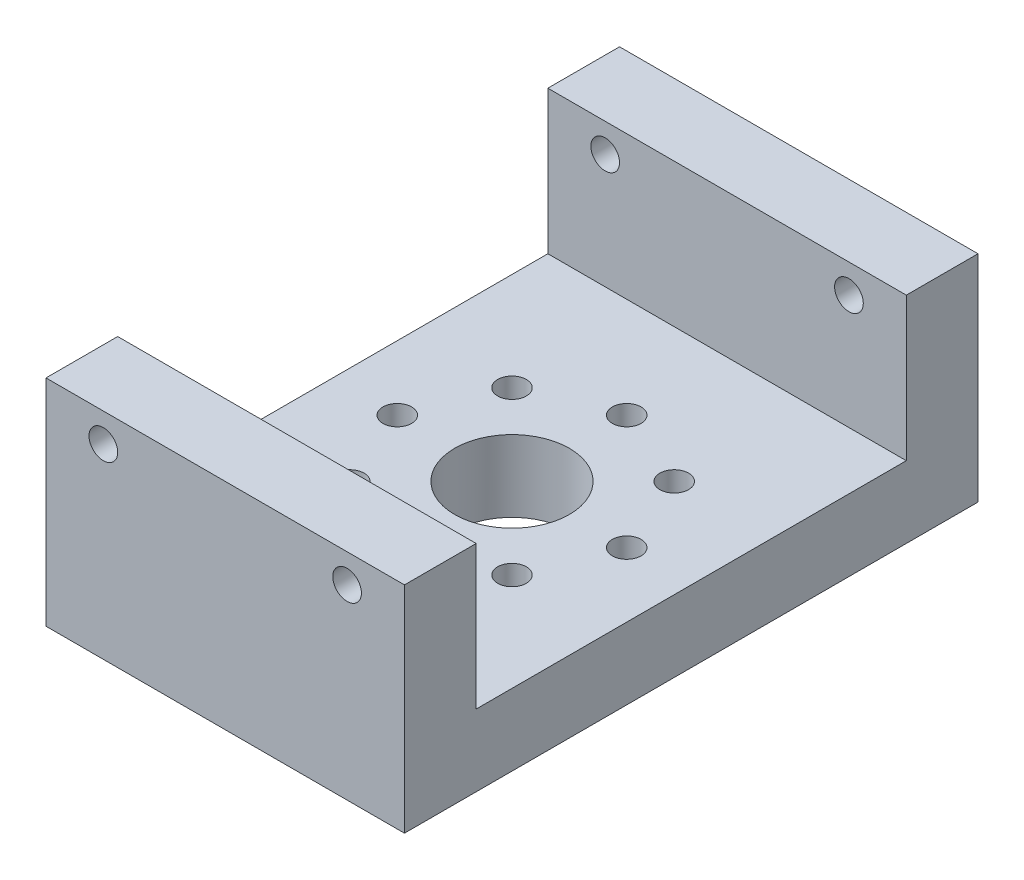
ISO-10303-21;
HEADER;
FILE_DESCRIPTION(('STEP AP214'),'2;1');
FILE_NAME('part.step','',(''),(''),'','','');
FILE_SCHEMA(('AUTOMOTIVE_DESIGN { 1 0 10303 214 1 1 1 1 }'));
ENDSEC;
DATA;
#1=APPLICATION_CONTEXT('core data for automotive mechanical design processes');
#2=APPLICATION_PROTOCOL_DEFINITION('international standard','automotive_design',2000,#1);
#3=PRODUCT_CONTEXT('',#1,'mechanical');
#4=PRODUCT('Part','Part','',(#3));
#5=PRODUCT_RELATED_PRODUCT_CATEGORY('part','',(#4));
#6=PRODUCT_DEFINITION_FORMATION('','',#4);
#7=PRODUCT_DEFINITION_CONTEXT('part definition',#1,'design');
#8=PRODUCT_DEFINITION('design','',#6,#7);
#9=PRODUCT_DEFINITION_SHAPE('','',#8);
#10=(LENGTH_UNIT() NAMED_UNIT(*) SI_UNIT(.MILLI.,.METRE.));
#11=(NAMED_UNIT(*) PLANE_ANGLE_UNIT() SI_UNIT($,.RADIAN.));
#12=(NAMED_UNIT(*) SI_UNIT($,.STERADIAN.) SOLID_ANGLE_UNIT());
#13=UNCERTAINTY_MEASURE_WITH_UNIT(LENGTH_MEASURE(1.E-05),#10,'distance_accuracy_value','');
#14=(GEOMETRIC_REPRESENTATION_CONTEXT(3) GLOBAL_UNCERTAINTY_ASSIGNED_CONTEXT((#13)) GLOBAL_UNIT_ASSIGNED_CONTEXT((#10,
#11,#12)) REPRESENTATION_CONTEXT('',''));
#15=CARTESIAN_POINT('',(0.,0.,0.));
#16=DIRECTION('',(0.,0.,1.));
#17=DIRECTION('',(1.,0.,0.));
#18=AXIS2_PLACEMENT_3D('',#15,#16,#17);
#19=CARTESIAN_POINT('',(0.,5.,0.));
#20=DIRECTION('',(0.,1.,0.));
#21=DIRECTION('',(0.,0.,1.));
#22=AXIS2_PLACEMENT_3D('',#19,#20,#21);
#23=PLANE('',#22);
#24=CARTESIAN_POINT('',(0.,5.,8.));
#25=DIRECTION('',(0.,1.,0.));
#26=DIRECTION('',(0.,0.,1.));
#27=AXIS2_PLACEMENT_3D('',#24,#25,#26);
#28=CIRCLE('',#27,1.);
#29=CARTESIAN_POINT('',(0.,5.,9.));
#30=VERTEX_POINT('',#29);
#31=EDGE_CURVE('E173',#30,#30,#28,.T.);
#32=ORIENTED_EDGE('',*,*,#31,.F.);
#33=EDGE_LOOP('',(#32));
#34=FACE_BOUND('',#33,.T.);
#35=CARTESIAN_POINT('',(-5.65685424949238,5.,-5.65685424949238));
#36=DIRECTION('',(0.,1.,0.));
#37=DIRECTION('',(0.,0.,1.));
#38=AXIS2_PLACEMENT_3D('',#35,#36,#37);
#39=CIRCLE('',#38,1.);
#40=CARTESIAN_POINT('',(-5.65685424949238,5.,-4.65685424949238));
#41=VERTEX_POINT('',#40);
#42=EDGE_CURVE('E556',#41,#41,#39,.T.);
#43=ORIENTED_EDGE('',*,*,#42,.F.);
#44=EDGE_LOOP('',(#43));
#45=FACE_BOUND('',#44,.T.);
#46=CARTESIAN_POINT('',(-8.,5.,0.));
#47=DIRECTION('',(0.,1.,0.));
#48=DIRECTION('',(0.,0.,1.));
#49=AXIS2_PLACEMENT_3D('',#46,#47,#48);
#50=CIRCLE('',#49,1.);
#51=CARTESIAN_POINT('',(-8.,5.,0.999999999999998));
#52=VERTEX_POINT('',#51);
#53=EDGE_CURVE('E554',#52,#52,#50,.T.);
#54=ORIENTED_EDGE('',*,*,#53,.F.);
#55=EDGE_LOOP('',(#54));
#56=FACE_BOUND('',#55,.T.);
#57=CARTESIAN_POINT('',(-5.65685424949238,5.,5.65685424949238));
#58=DIRECTION('',(0.,1.,0.));
#59=DIRECTION('',(0.,0.,1.));
#60=AXIS2_PLACEMENT_3D('',#57,#58,#59);
#61=CIRCLE('',#60,1.);
#62=CARTESIAN_POINT('',(-5.65685424949238,5.,6.65685424949238));
#63=VERTEX_POINT('',#62);
#64=EDGE_CURVE('E551',#63,#63,#61,.T.);
#65=ORIENTED_EDGE('',*,*,#64,.F.);
#66=EDGE_LOOP('',(#65));
#67=FACE_BOUND('',#66,.T.);
#68=CARTESIAN_POINT('',(0.,5.,0.));
#69=DIRECTION('',(0.,1.,0.));
#70=DIRECTION('',(0.,0.,1.));
#71=AXIS2_PLACEMENT_3D('',#68,#69,#70);
#72=CIRCLE('',#71,4.);
#73=CARTESIAN_POINT('',(0.,5.,4.));
#74=VERTEX_POINT('',#73);
#75=EDGE_CURVE('E548',#74,#74,#72,.T.);
#76=ORIENTED_EDGE('',*,*,#75,.F.);
#77=EDGE_LOOP('',(#76));
#78=FACE_BOUND('',#77,.T.);
#79=CARTESIAN_POINT('',(0.,5.,-8.));
#80=DIRECTION('',(0.,1.,0.));
#81=DIRECTION('',(0.,0.,1.));
#82=AXIS2_PLACEMENT_3D('',#79,#80,#81);
#83=CIRCLE('',#82,1.);
#84=CARTESIAN_POINT('',(0.,5.,-7.));
#85=VERTEX_POINT('',#84);
#86=EDGE_CURVE('E545',#85,#85,#83,.T.);
#87=ORIENTED_EDGE('',*,*,#86,.F.);
#88=EDGE_LOOP('',(#87));
#89=FACE_BOUND('',#88,.T.);
#90=CARTESIAN_POINT('',(5.65685424949238,5.,-5.65685424949238));
#91=DIRECTION('',(0.,1.,0.));
#92=DIRECTION('',(0.,0.,1.));
#93=AXIS2_PLACEMENT_3D('',#90,#91,#92);
#94=CIRCLE('',#93,1.);
#95=CARTESIAN_POINT('',(5.65685424949238,5.,-4.65685424949238));
#96=VERTEX_POINT('',#95);
#97=EDGE_CURVE('E542',#96,#96,#94,.T.);
#98=ORIENTED_EDGE('',*,*,#97,.F.);
#99=EDGE_LOOP('',(#98));
#100=FACE_BOUND('',#99,.T.);
#101=CARTESIAN_POINT('',(8.,5.,0.));
#102=DIRECTION('',(0.,1.,0.));
#103=DIRECTION('',(0.,0.,1.));
#104=AXIS2_PLACEMENT_3D('',#101,#102,#103);
#105=CIRCLE('',#104,1.);
#106=CARTESIAN_POINT('',(8.,5.,1.));
#107=VERTEX_POINT('',#106);
#108=EDGE_CURVE('E514',#107,#107,#105,.T.);
#109=ORIENTED_EDGE('',*,*,#108,.F.);
#110=EDGE_LOOP('',(#109));
#111=FACE_BOUND('',#110,.T.);
#112=CARTESIAN_POINT('',(5.65685424949238,5.,5.65685424949238));
#113=DIRECTION('',(0.,1.,0.));
#114=DIRECTION('',(0.,0.,1.));
#115=AXIS2_PLACEMENT_3D('',#112,#113,#114);
#116=CIRCLE('',#115,1.);
#117=CARTESIAN_POINT('',(5.65685424949238,5.,6.65685424949238));
#118=VERTEX_POINT('',#117);
#119=EDGE_CURVE('E510',#118,#118,#116,.T.);
#120=ORIENTED_EDGE('',*,*,#119,.F.);
#121=EDGE_LOOP('',(#120));
#122=FACE_BOUND('',#121,.T.);
#123=DIRECTION('',(0.,0.,1.));
#124=VECTOR('',#123,1.);
#125=CARTESIAN_POINT('',(-12.5,5.,-20.));
#126=LINE('',#125,#124);
#127=CARTESIAN_POINT('',(-12.5,5.,-15.));
#128=VERTEX_POINT('',#127);
#129=CARTESIAN_POINT('',(-12.5,5.,15.));
#130=VERTEX_POINT('',#129);
#131=EDGE_CURVE('E129',#128,#130,#126,.T.);
#132=ORIENTED_EDGE('',*,*,#131,.T.);
#133=DIRECTION('',(-1.,0.,0.));
#134=VECTOR('',#133,1.);
#135=CARTESIAN_POINT('',(-12.5,5.,15.));
#136=LINE('',#135,#134);
#137=CARTESIAN_POINT('',(12.5,5.,15.));
#138=VERTEX_POINT('',#137);
#139=EDGE_CURVE('E118',#138,#130,#136,.T.);
#140=ORIENTED_EDGE('',*,*,#139,.F.);
#141=DIRECTION('',(0.,0.,-1.));
#142=VECTOR('',#141,1.);
#143=CARTESIAN_POINT('',(12.5,5.,-20.));
#144=LINE('',#143,#142);
#145=CARTESIAN_POINT('',(12.5,5.,-15.));
#146=VERTEX_POINT('',#145);
#147=EDGE_CURVE('E135',#138,#146,#144,.T.);
#148=ORIENTED_EDGE('',*,*,#147,.T.);
#149=DIRECTION('',(1.,0.,0.));
#150=VECTOR('',#149,1.);
#151=CARTESIAN_POINT('',(-12.5,5.,-15.));
#152=LINE('',#151,#150);
#153=EDGE_CURVE('E76',#128,#146,#152,.T.);
#154=ORIENTED_EDGE('',*,*,#153,.F.);
#155=EDGE_LOOP('',(#132,#140,#148,#154));
#156=FACE_BOUND('',#155,.T.);
#157=ADVANCED_FACE('F51',(#34,#45,#56,#67,#78,#89,#100,#111,#122,#156),#23,.T.);
#158=CARTESIAN_POINT('',(12.5,5.,-20.));
#159=DIRECTION('',(-1.,0.,0.));
#160=DIRECTION('',(0.,0.,1.));
#161=AXIS2_PLACEMENT_3D('',#158,#159,#160);
#162=PLANE('',#161);
#163=DIRECTION('',(0.,0.,-1.));
#164=VECTOR('',#163,1.);
#165=CARTESIAN_POINT('',(12.5,0.,-20.));
#166=LINE('',#165,#164);
#167=CARTESIAN_POINT('',(12.5,0.,20.));
#168=VERTEX_POINT('',#167);
#169=CARTESIAN_POINT('',(12.5,0.,-20.));
#170=VERTEX_POINT('',#169);
#171=EDGE_CURVE('E144',#168,#170,#166,.T.);
#172=ORIENTED_EDGE('',*,*,#171,.T.);
#173=DIRECTION('',(0.,-1.,0.));
#174=VECTOR('',#173,1.);
#175=CARTESIAN_POINT('',(12.5,5.,-20.));
#176=LINE('',#175,#174);
#177=CARTESIAN_POINT('',(12.5,15.,-20.));
#178=VERTEX_POINT('',#177);
#179=EDGE_CURVE('E13',#178,#170,#176,.T.);
#180=ORIENTED_EDGE('',*,*,#179,.F.);
#181=DIRECTION('',(0.,0.,-1.));
#182=VECTOR('',#181,1.);
#183=CARTESIAN_POINT('',(12.5,15.,-20.));
#184=LINE('',#183,#182);
#185=CARTESIAN_POINT('',(12.5,15.,-15.));
#186=VERTEX_POINT('',#185);
#187=EDGE_CURVE('E197',#186,#178,#184,.T.);
#188=ORIENTED_EDGE('',*,*,#187,.F.);
#189=DIRECTION('',(0.,-1.,0.));
#190=VECTOR('',#189,1.);
#191=CARTESIAN_POINT('',(12.5,15.,-15.));
#192=LINE('',#191,#190);
#193=EDGE_CURVE('E203',#186,#146,#192,.T.);
#194=ORIENTED_EDGE('',*,*,#193,.T.);
#195=ORIENTED_EDGE('',*,*,#147,.F.);
#196=DIRECTION('',(0.,-1.,0.));
#197=VECTOR('',#196,1.);
#198=CARTESIAN_POINT('',(12.5,15.,15.));
#199=LINE('',#198,#197);
#200=CARTESIAN_POINT('',(12.5,15.,15.));
#201=VERTEX_POINT('',#200);
#202=EDGE_CURVE('E68',#201,#138,#199,.T.);
#203=ORIENTED_EDGE('',*,*,#202,.F.);
#204=DIRECTION('',(0.,0.,-1.));
#205=VECTOR('',#204,1.);
#206=CARTESIAN_POINT('',(12.5,15.,20.));
#207=LINE('',#206,#205);
#208=CARTESIAN_POINT('',(12.5,15.,20.));
#209=VERTEX_POINT('',#208);
#210=EDGE_CURVE('E186',#209,#201,#207,.T.);
#211=ORIENTED_EDGE('',*,*,#210,.F.);
#212=DIRECTION('',(0.,-1.,0.));
#213=VECTOR('',#212,1.);
#214=CARTESIAN_POINT('',(12.5,5.,20.));
#215=LINE('',#214,#213);
#216=EDGE_CURVE('E134',#209,#168,#215,.T.);
#217=ORIENTED_EDGE('',*,*,#216,.T.);
#218=EDGE_LOOP('',(#172,#180,#188,#194,#195,#203,#211,#217));
#219=FACE_BOUND('',#218,.T.);
#220=ADVANCED_FACE('F53',(#219),#162,.F.);
#221=CARTESIAN_POINT('',(-12.5,5.,-20.));
#222=DIRECTION('',(0.,0.,1.));
#223=DIRECTION('',(1.,0.,0.));
#224=AXIS2_PLACEMENT_3D('',#221,#222,#223);
#225=PLANE('',#224);
#226=CARTESIAN_POINT('',(-8.5,13.,-20.));
#227=DIRECTION('',(0.,0.,1.));
#228=DIRECTION('',(1.,0.,0.));
#229=AXIS2_PLACEMENT_3D('',#226,#227,#228);
#230=CIRCLE('',#229,0.999999999999998);
#231=CARTESIAN_POINT('',(-7.5,13.,-20.));
#232=VERTEX_POINT('',#231);
#233=EDGE_CURVE('E159',#232,#232,#230,.T.);
#234=ORIENTED_EDGE('',*,*,#233,.T.);
#235=EDGE_LOOP('',(#234));
#236=FACE_BOUND('',#235,.T.);
#237=CARTESIAN_POINT('',(8.5,13.,-20.));
#238=DIRECTION('',(0.,0.,1.));
#239=DIRECTION('',(1.,0.,0.));
#240=AXIS2_PLACEMENT_3D('',#237,#238,#239);
#241=CIRCLE('',#240,1.);
#242=CARTESIAN_POINT('',(9.5,13.,-20.));
#243=VERTEX_POINT('',#242);
#244=EDGE_CURVE('E178',#243,#243,#241,.T.);
#245=ORIENTED_EDGE('',*,*,#244,.T.);
#246=EDGE_LOOP('',(#245));
#247=FACE_BOUND('',#246,.T.);
#248=DIRECTION('',(-1.,0.,0.));
#249=VECTOR('',#248,1.);
#250=CARTESIAN_POINT('',(-12.5,0.,-20.));
#251=LINE('',#250,#249);
#252=CARTESIAN_POINT('',(-12.5,0.,-20.));
#253=VERTEX_POINT('',#252);
#254=EDGE_CURVE('E147',#170,#253,#251,.T.);
#255=ORIENTED_EDGE('',*,*,#254,.T.);
#256=DIRECTION('',(0.,-1.,0.));
#257=VECTOR('',#256,1.);
#258=CARTESIAN_POINT('',(-12.5,5.,-20.));
#259=LINE('',#258,#257);
#260=CARTESIAN_POINT('',(-12.5,15.,-20.));
#261=VERTEX_POINT('',#260);
#262=EDGE_CURVE('E60',#261,#253,#259,.T.);
#263=ORIENTED_EDGE('',*,*,#262,.F.);
#264=DIRECTION('',(-1.,0.,0.));
#265=VECTOR('',#264,1.);
#266=CARTESIAN_POINT('',(-12.5,15.,-20.));
#267=LINE('',#266,#265);
#268=EDGE_CURVE('E200',#178,#261,#267,.T.);
#269=ORIENTED_EDGE('',*,*,#268,.F.);
#270=ORIENTED_EDGE('',*,*,#179,.T.);
#271=EDGE_LOOP('',(#255,#263,#269,#270));
#272=FACE_BOUND('',#271,.T.);
#273=ADVANCED_FACE('F216',(#236,#247,#272),#225,.F.);
#274=CARTESIAN_POINT('',(-12.5,5.,-20.));
#275=DIRECTION('',(1.,0.,0.));
#276=DIRECTION('',(0.,0.,-1.));
#277=AXIS2_PLACEMENT_3D('',#274,#275,#276);
#278=PLANE('',#277);
#279=DIRECTION('',(0.,0.,1.));
#280=VECTOR('',#279,1.);
#281=CARTESIAN_POINT('',(-12.5,0.,-20.));
#282=LINE('',#281,#280);
#283=CARTESIAN_POINT('',(-12.5,0.,20.));
#284=VERTEX_POINT('',#283);
#285=EDGE_CURVE('E150',#253,#284,#282,.T.);
#286=ORIENTED_EDGE('',*,*,#285,.T.);
#287=DIRECTION('',(0.,-1.,0.));
#288=VECTOR('',#287,1.);
#289=CARTESIAN_POINT('',(-12.5,5.,20.));
#290=LINE('',#289,#288);
#291=CARTESIAN_POINT('',(-12.5,15.,20.));
#292=VERTEX_POINT('',#291);
#293=EDGE_CURVE('E138',#292,#284,#290,.T.);
#294=ORIENTED_EDGE('',*,*,#293,.F.);
#295=DIRECTION('',(0.,0.,1.));
#296=VECTOR('',#295,1.);
#297=CARTESIAN_POINT('',(-12.5,15.,20.));
#298=LINE('',#297,#296);
#299=CARTESIAN_POINT('',(-12.5,15.,15.));
#300=VERTEX_POINT('',#299);
#301=EDGE_CURVE('E124',#300,#292,#298,.T.);
#302=ORIENTED_EDGE('',*,*,#301,.F.);
#303=DIRECTION('',(0.,-1.,0.));
#304=VECTOR('',#303,1.);
#305=CARTESIAN_POINT('',(-12.5,15.,15.));
#306=LINE('',#305,#304);
#307=EDGE_CURVE('E121',#300,#130,#306,.T.);
#308=ORIENTED_EDGE('',*,*,#307,.T.);
#309=ORIENTED_EDGE('',*,*,#131,.F.);
#310=DIRECTION('',(0.,-1.,0.));
#311=VECTOR('',#310,1.);
#312=CARTESIAN_POINT('',(-12.5,15.,-15.));
#313=LINE('',#312,#311);
#314=CARTESIAN_POINT('',(-12.5,15.,-15.));
#315=VERTEX_POINT('',#314);
#316=EDGE_CURVE('E148',#315,#128,#313,.T.);
#317=ORIENTED_EDGE('',*,*,#316,.F.);
#318=DIRECTION('',(0.,0.,1.));
#319=VECTOR('',#318,1.);
#320=CARTESIAN_POINT('',(-12.5,15.,-20.));
#321=LINE('',#320,#319);
#322=EDGE_CURVE('E192',#261,#315,#321,.T.);
#323=ORIENTED_EDGE('',*,*,#322,.F.);
#324=ORIENTED_EDGE('',*,*,#262,.T.);
#325=EDGE_LOOP('',(#286,#294,#302,#308,#309,#317,#323,#324));
#326=FACE_BOUND('',#325,.T.);
#327=ADVANCED_FACE('F127',(#326),#278,.F.);
#328=CARTESIAN_POINT('',(-12.5,5.,20.));
#329=DIRECTION('',(0.,0.,-1.));
#330=DIRECTION('',(-1.,0.,0.));
#331=AXIS2_PLACEMENT_3D('',#328,#329,#330);
#332=PLANE('',#331);
#333=CARTESIAN_POINT('',(-8.5,13.,20.));
#334=DIRECTION('',(0.,0.,1.));
#335=DIRECTION('',(1.,0.,0.));
#336=AXIS2_PLACEMENT_3D('',#333,#334,#335);
#337=CIRCLE('',#336,0.999999999999998);
#338=CARTESIAN_POINT('',(-7.5,13.,20.));
#339=VERTEX_POINT('',#338);
#340=EDGE_CURVE('E165',#339,#339,#337,.T.);
#341=ORIENTED_EDGE('',*,*,#340,.F.);
#342=EDGE_LOOP('',(#341));
#343=FACE_BOUND('',#342,.T.);
#344=CARTESIAN_POINT('',(8.5,13.,20.));
#345=DIRECTION('',(0.,0.,1.));
#346=DIRECTION('',(1.,0.,0.));
#347=AXIS2_PLACEMENT_3D('',#344,#345,#346);
#348=CIRCLE('',#347,1.);
#349=CARTESIAN_POINT('',(9.5,13.,20.));
#350=VERTEX_POINT('',#349);
#351=EDGE_CURVE('E170',#350,#350,#348,.T.);
#352=ORIENTED_EDGE('',*,*,#351,.F.);
#353=EDGE_LOOP('',(#352));
#354=FACE_BOUND('',#353,.T.);
#355=DIRECTION('',(1.,0.,0.));
#356=VECTOR('',#355,1.);
#357=CARTESIAN_POINT('',(-12.5,0.,20.));
#358=LINE('',#357,#356);
#359=EDGE_CURVE('E140',#284,#168,#358,.T.);
#360=ORIENTED_EDGE('',*,*,#359,.T.);
#361=ORIENTED_EDGE('',*,*,#216,.F.);
#362=DIRECTION('',(1.,0.,0.));
#363=VECTOR('',#362,1.);
#364=CARTESIAN_POINT('',(-12.5,15.,20.));
#365=LINE('',#364,#363);
#366=EDGE_CURVE('E188',#292,#209,#365,.T.);
#367=ORIENTED_EDGE('',*,*,#366,.F.);
#368=ORIENTED_EDGE('',*,*,#293,.T.);
#369=EDGE_LOOP('',(#360,#361,#367,#368));
#370=FACE_BOUND('',#369,.T.);
#371=ADVANCED_FACE('F223',(#343,#354,#370),#332,.F.);
#372=CARTESIAN_POINT('',(0.,0.,0.));
#373=DIRECTION('',(0.,1.,0.));
#374=DIRECTION('',(0.,0.,1.));
#375=AXIS2_PLACEMENT_3D('',#372,#373,#374);
#376=PLANE('',#375);
#377=CARTESIAN_POINT('',(0.,0.,8.));
#378=DIRECTION('',(0.,-1.,0.));
#379=DIRECTION('',(0.,0.,-1.));
#380=AXIS2_PLACEMENT_3D('',#377,#378,#379);
#381=CIRCLE('',#380,1.);
#382=CARTESIAN_POINT('',(0.,0.,7.));
#383=VERTEX_POINT('',#382);
#384=EDGE_CURVE('E509',#383,#383,#381,.T.);
#385=ORIENTED_EDGE('',*,*,#384,.F.);
#386=EDGE_LOOP('',(#385));
#387=FACE_BOUND('',#386,.T.);
#388=CARTESIAN_POINT('',(-5.65685424949238,0.,-5.65685424949238));
#389=DIRECTION('',(0.,-1.,0.));
#390=DIRECTION('',(0.,0.,-1.));
#391=AXIS2_PLACEMENT_3D('',#388,#389,#390);
#392=CIRCLE('',#391,1.);
#393=CARTESIAN_POINT('',(-5.65685424949238,0.,-6.65685424949238));
#394=VERTEX_POINT('',#393);
#395=EDGE_CURVE('E527',#394,#394,#392,.T.);
#396=ORIENTED_EDGE('',*,*,#395,.F.);
#397=EDGE_LOOP('',(#396));
#398=FACE_BOUND('',#397,.T.);
#399=CARTESIAN_POINT('',(-8.,0.,0.));
#400=DIRECTION('',(0.,-1.,0.));
#401=DIRECTION('',(0.,0.,-1.));
#402=AXIS2_PLACEMENT_3D('',#399,#400,#401);
#403=CIRCLE('',#402,1.);
#404=CARTESIAN_POINT('',(-8.,0.,-1.));
#405=VERTEX_POINT('',#404);
#406=EDGE_CURVE('E523',#405,#405,#403,.T.);
#407=ORIENTED_EDGE('',*,*,#406,.F.);
#408=EDGE_LOOP('',(#407));
#409=FACE_BOUND('',#408,.T.);
#410=CARTESIAN_POINT('',(-5.65685424949238,0.,5.65685424949238));
#411=DIRECTION('',(0.,-1.,0.));
#412=DIRECTION('',(0.,0.,-1.));
#413=AXIS2_PLACEMENT_3D('',#410,#411,#412);
#414=CIRCLE('',#413,1.);
#415=CARTESIAN_POINT('',(-5.65685424949238,0.,4.65685424949238));
#416=VERTEX_POINT('',#415);
#417=EDGE_CURVE('E520',#416,#416,#414,.T.);
#418=ORIENTED_EDGE('',*,*,#417,.F.);
#419=EDGE_LOOP('',(#418));
#420=FACE_BOUND('',#419,.T.);
#421=CARTESIAN_POINT('',(0.,0.,0.));
#422=DIRECTION('',(0.,-1.,0.));
#423=DIRECTION('',(0.,0.,-1.));
#424=AXIS2_PLACEMENT_3D('',#421,#422,#423);
#425=CIRCLE('',#424,4.);
#426=CARTESIAN_POINT('',(0.,0.,-4.));
#427=VERTEX_POINT('',#426);
#428=EDGE_CURVE('E524',#427,#427,#425,.T.);
#429=ORIENTED_EDGE('',*,*,#428,.F.);
#430=EDGE_LOOP('',(#429));
#431=FACE_BOUND('',#430,.T.);
#432=CARTESIAN_POINT('',(0.,0.,-8.));
#433=DIRECTION('',(0.,-1.,0.));
#434=DIRECTION('',(0.,0.,-1.));
#435=AXIS2_PLACEMENT_3D('',#432,#433,#434);
#436=CIRCLE('',#435,1.);
#437=CARTESIAN_POINT('',(0.,0.,-9.));
#438=VERTEX_POINT('',#437);
#439=EDGE_CURVE('E530',#438,#438,#436,.T.);
#440=ORIENTED_EDGE('',*,*,#439,.F.);
#441=EDGE_LOOP('',(#440));
#442=FACE_BOUND('',#441,.T.);
#443=CARTESIAN_POINT('',(5.65685424949238,0.,-5.65685424949238));
#444=DIRECTION('',(0.,-1.,0.));
#445=DIRECTION('',(0.,0.,-1.));
#446=AXIS2_PLACEMENT_3D('',#443,#444,#445);
#447=CIRCLE('',#446,1.);
#448=CARTESIAN_POINT('',(5.65685424949238,0.,-6.65685424949238));
#449=VERTEX_POINT('',#448);
#450=EDGE_CURVE('E535',#449,#449,#447,.T.);
#451=ORIENTED_EDGE('',*,*,#450,.F.);
#452=EDGE_LOOP('',(#451));
#453=FACE_BOUND('',#452,.T.);
#454=CARTESIAN_POINT('',(8.,0.,0.));
#455=DIRECTION('',(0.,-1.,0.));
#456=DIRECTION('',(0.,0.,-1.));
#457=AXIS2_PLACEMENT_3D('',#454,#455,#456);
#458=CIRCLE('',#457,1.);
#459=CARTESIAN_POINT('',(8.,0.,-1.));
#460=VERTEX_POINT('',#459);
#461=EDGE_CURVE('E517',#460,#460,#458,.T.);
#462=ORIENTED_EDGE('',*,*,#461,.F.);
#463=EDGE_LOOP('',(#462));
#464=FACE_BOUND('',#463,.T.);
#465=CARTESIAN_POINT('',(5.65685424949238,0.,5.65685424949238));
#466=DIRECTION('',(0.,-1.,0.));
#467=DIRECTION('',(0.,0.,-1.));
#468=AXIS2_PLACEMENT_3D('',#465,#466,#467);
#469=CIRCLE('',#468,1.);
#470=CARTESIAN_POINT('',(5.65685424949238,0.,4.65685424949238));
#471=VERTEX_POINT('',#470);
#472=EDGE_CURVE('E511',#471,#471,#469,.T.);
#473=ORIENTED_EDGE('',*,*,#472,.F.);
#474=EDGE_LOOP('',(#473));
#475=FACE_BOUND('',#474,.T.);
#476=ORIENTED_EDGE('',*,*,#171,.F.);
#477=ORIENTED_EDGE('',*,*,#359,.F.);
#478=ORIENTED_EDGE('',*,*,#285,.F.);
#479=ORIENTED_EDGE('',*,*,#254,.F.);
#480=EDGE_LOOP('',(#476,#477,#478,#479));
#481=FACE_BOUND('',#480,.T.);
#482=ADVANCED_FACE('F219',(#387,#398,#409,#420,#431,#442,#453,#464,#475,#481),#376,.F.);
#483=CARTESIAN_POINT('',(-12.5,15.,-15.));
#484=DIRECTION('',(0.,0.,-1.));
#485=DIRECTION('',(-1.,0.,0.));
#486=AXIS2_PLACEMENT_3D('',#483,#484,#485);
#487=PLANE('',#486);
#488=CARTESIAN_POINT('',(-8.5,13.,-15.));
#489=DIRECTION('',(0.,0.,-1.));
#490=DIRECTION('',(-1.,0.,0.));
#491=AXIS2_PLACEMENT_3D('',#488,#489,#490);
#492=CIRCLE('',#491,0.999999999999998);
#493=CARTESIAN_POINT('',(-9.5,13.,-15.));
#494=VERTEX_POINT('',#493);
#495=EDGE_CURVE('E181',#494,#494,#492,.T.);
#496=ORIENTED_EDGE('',*,*,#495,.T.);
#497=EDGE_LOOP('',(#496));
#498=FACE_BOUND('',#497,.T.);
#499=CARTESIAN_POINT('',(8.5,13.,-15.));
#500=DIRECTION('',(0.,0.,-1.));
#501=DIRECTION('',(-1.,0.,0.));
#502=AXIS2_PLACEMENT_3D('',#499,#500,#501);
#503=CIRCLE('',#502,1.);
#504=CARTESIAN_POINT('',(7.5,13.,-15.));
#505=VERTEX_POINT('',#504);
#506=EDGE_CURVE('E158',#505,#505,#503,.T.);
#507=ORIENTED_EDGE('',*,*,#506,.T.);
#508=EDGE_LOOP('',(#507));
#509=FACE_BOUND('',#508,.T.);
#510=ORIENTED_EDGE('',*,*,#153,.T.);
#511=ORIENTED_EDGE('',*,*,#193,.F.);
#512=DIRECTION('',(1.,0.,0.));
#513=VECTOR('',#512,1.);
#514=CARTESIAN_POINT('',(-12.5,15.,-15.));
#515=LINE('',#514,#513);
#516=EDGE_CURVE('E195',#315,#186,#515,.T.);
#517=ORIENTED_EDGE('',*,*,#516,.F.);
#518=ORIENTED_EDGE('',*,*,#316,.T.);
#519=EDGE_LOOP('',(#510,#511,#517,#518));
#520=FACE_BOUND('',#519,.T.);
#521=ADVANCED_FACE('F207',(#498,#509,#520),#487,.F.);
#522=CARTESIAN_POINT('',(0.,15.,0.));
#523=DIRECTION('',(0.,1.,0.));
#524=DIRECTION('',(0.,0.,1.));
#525=AXIS2_PLACEMENT_3D('',#522,#523,#524);
#526=PLANE('',#525);
#527=ORIENTED_EDGE('',*,*,#322,.T.);
#528=ORIENTED_EDGE('',*,*,#516,.T.);
#529=ORIENTED_EDGE('',*,*,#187,.T.);
#530=ORIENTED_EDGE('',*,*,#268,.T.);
#531=EDGE_LOOP('',(#527,#528,#529,#530));
#532=FACE_BOUND('',#531,.T.);
#533=ADVANCED_FACE('F212',(#532),#526,.T.);
#534=CARTESIAN_POINT('',(-12.5,15.,15.));
#535=DIRECTION('',(0.,0.,1.));
#536=DIRECTION('',(1.,0.,0.));
#537=AXIS2_PLACEMENT_3D('',#534,#535,#536);
#538=PLANE('',#537);
#539=CARTESIAN_POINT('',(-8.5,13.,15.));
#540=DIRECTION('',(0.,0.,1.));
#541=DIRECTION('',(1.,0.,0.));
#542=AXIS2_PLACEMENT_3D('',#539,#540,#541);
#543=CIRCLE('',#542,0.999999999999998);
#544=CARTESIAN_POINT('',(-7.5,13.,15.));
#545=VERTEX_POINT('',#544);
#546=EDGE_CURVE('E55',#545,#545,#543,.T.);
#547=ORIENTED_EDGE('',*,*,#546,.T.);
#548=EDGE_LOOP('',(#547));
#549=FACE_BOUND('',#548,.T.);
#550=CARTESIAN_POINT('',(8.5,13.,15.));
#551=DIRECTION('',(0.,0.,1.));
#552=DIRECTION('',(1.,0.,0.));
#553=AXIS2_PLACEMENT_3D('',#550,#551,#552);
#554=CIRCLE('',#553,1.);
#555=CARTESIAN_POINT('',(9.5,13.,15.));
#556=VERTEX_POINT('',#555);
#557=EDGE_CURVE('E156',#556,#556,#554,.T.);
#558=ORIENTED_EDGE('',*,*,#557,.T.);
#559=EDGE_LOOP('',(#558));
#560=FACE_BOUND('',#559,.T.);
#561=ORIENTED_EDGE('',*,*,#139,.T.);
#562=ORIENTED_EDGE('',*,*,#307,.F.);
#563=DIRECTION('',(-1.,0.,0.));
#564=VECTOR('',#563,1.);
#565=CARTESIAN_POINT('',(-12.5,15.,15.));
#566=LINE('',#565,#564);
#567=EDGE_CURVE('E132',#201,#300,#566,.T.);
#568=ORIENTED_EDGE('',*,*,#567,.F.);
#569=ORIENTED_EDGE('',*,*,#202,.T.);
#570=EDGE_LOOP('',(#561,#562,#568,#569));
#571=FACE_BOUND('',#570,.T.);
#572=ADVANCED_FACE('F120',(#549,#560,#571),#538,.F.);
#573=CARTESIAN_POINT('',(0.,15.,0.));
#574=DIRECTION('',(0.,-1.,0.));
#575=DIRECTION('',(0.,0.,-1.));
#576=AXIS2_PLACEMENT_3D('',#573,#574,#575);
#577=PLANE('',#576);
#578=ORIENTED_EDGE('',*,*,#301,.T.);
#579=ORIENTED_EDGE('',*,*,#366,.T.);
#580=ORIENTED_EDGE('',*,*,#210,.T.);
#581=ORIENTED_EDGE('',*,*,#567,.T.);
#582=EDGE_LOOP('',(#578,#579,#580,#581));
#583=FACE_BOUND('',#582,.T.);
#584=ADVANCED_FACE('F226',(#583),#577,.F.);
#585=CARTESIAN_POINT('',(8.5,13.,-20.));
#586=DIRECTION('',(0.,0.,1.));
#587=DIRECTION('',(1.,0.,0.));
#588=AXIS2_PLACEMENT_3D('',#585,#586,#587);
#589=CYLINDRICAL_SURFACE('',#588,1.);
#590=ORIENTED_EDGE('',*,*,#351,.T.);
#591=EDGE_LOOP('',(#590));
#592=FACE_BOUND('',#591,.T.);
#593=ORIENTED_EDGE('',*,*,#557,.F.);
#594=EDGE_LOOP('',(#593));
#595=FACE_BOUND('',#594,.T.);
#596=ADVANCED_FACE('F287',(#592,#595),#589,.F.);
#597=CARTESIAN_POINT('',(-8.5,13.,-20.));
#598=DIRECTION('',(0.,0.,1.));
#599=DIRECTION('',(1.,0.,0.));
#600=AXIS2_PLACEMENT_3D('',#597,#598,#599);
#601=CYLINDRICAL_SURFACE('',#600,0.999999999999998);
#602=ORIENTED_EDGE('',*,*,#340,.T.);
#603=EDGE_LOOP('',(#602));
#604=FACE_BOUND('',#603,.T.);
#605=ORIENTED_EDGE('',*,*,#546,.F.);
#606=EDGE_LOOP('',(#605));
#607=FACE_BOUND('',#606,.T.);
#608=ADVANCED_FACE('F293',(#604,#607),#601,.F.);
#609=ORIENTED_EDGE('',*,*,#244,.F.);
#610=EDGE_LOOP('',(#609));
#611=FACE_BOUND('',#610,.T.);
#612=ORIENTED_EDGE('',*,*,#506,.F.);
#613=EDGE_LOOP('',(#612));
#614=FACE_BOUND('',#613,.T.);
#615=ADVANCED_FACE('F296',(#611,#614),#589,.F.);
#616=ORIENTED_EDGE('',*,*,#233,.F.);
#617=EDGE_LOOP('',(#616));
#618=FACE_BOUND('',#617,.T.);
#619=ORIENTED_EDGE('',*,*,#495,.F.);
#620=EDGE_LOOP('',(#619));
#621=FACE_BOUND('',#620,.T.);
#622=ADVANCED_FACE('F304',(#618,#621),#601,.F.);
#623=CARTESIAN_POINT('',(5.65685424949238,10.,5.65685424949238));
#624=DIRECTION('',(0.,-1.,0.));
#625=DIRECTION('',(0.,0.,-1.));
#626=AXIS2_PLACEMENT_3D('',#623,#624,#625);
#627=CYLINDRICAL_SURFACE('',#626,1.);
#628=ORIENTED_EDGE('',*,*,#119,.T.);
#629=EDGE_LOOP('',(#628));
#630=FACE_BOUND('',#629,.T.);
#631=ORIENTED_EDGE('',*,*,#472,.T.);
#632=EDGE_LOOP('',(#631));
#633=FACE_BOUND('',#632,.T.);
#634=ADVANCED_FACE('F316',(#630,#633),#627,.F.);
#635=CARTESIAN_POINT('',(8.,10.,0.));
#636=DIRECTION('',(0.,-1.,0.));
#637=DIRECTION('',(0.,0.,-1.));
#638=AXIS2_PLACEMENT_3D('',#635,#636,#637);
#639=CYLINDRICAL_SURFACE('',#638,1.);
#640=ORIENTED_EDGE('',*,*,#108,.T.);
#641=EDGE_LOOP('',(#640));
#642=FACE_BOUND('',#641,.T.);
#643=ORIENTED_EDGE('',*,*,#461,.T.);
#644=EDGE_LOOP('',(#643));
#645=FACE_BOUND('',#644,.T.);
#646=ADVANCED_FACE('F322',(#642,#645),#639,.F.);
#647=CARTESIAN_POINT('',(5.65685424949238,10.,-5.65685424949238));
#648=DIRECTION('',(0.,-1.,0.));
#649=DIRECTION('',(0.,0.,-1.));
#650=AXIS2_PLACEMENT_3D('',#647,#648,#649);
#651=CYLINDRICAL_SURFACE('',#650,1.);
#652=ORIENTED_EDGE('',*,*,#97,.T.);
#653=EDGE_LOOP('',(#652));
#654=FACE_BOUND('',#653,.T.);
#655=ORIENTED_EDGE('',*,*,#450,.T.);
#656=EDGE_LOOP('',(#655));
#657=FACE_BOUND('',#656,.T.);
#658=ADVANCED_FACE('F330',(#654,#657),#651,.F.);
#659=CARTESIAN_POINT('',(0.,10.,-8.));
#660=DIRECTION('',(0.,-1.,0.));
#661=DIRECTION('',(0.,0.,-1.));
#662=AXIS2_PLACEMENT_3D('',#659,#660,#661);
#663=CYLINDRICAL_SURFACE('',#662,1.);
#664=ORIENTED_EDGE('',*,*,#86,.T.);
#665=EDGE_LOOP('',(#664));
#666=FACE_BOUND('',#665,.T.);
#667=ORIENTED_EDGE('',*,*,#439,.T.);
#668=EDGE_LOOP('',(#667));
#669=FACE_BOUND('',#668,.T.);
#670=ADVANCED_FACE('F338',(#666,#669),#663,.F.);
#671=CARTESIAN_POINT('',(0.,10.,0.));
#672=DIRECTION('',(0.,-1.,0.));
#673=DIRECTION('',(0.,0.,-1.));
#674=AXIS2_PLACEMENT_3D('',#671,#672,#673);
#675=CYLINDRICAL_SURFACE('',#674,4.);
#676=ORIENTED_EDGE('',*,*,#75,.T.);
#677=EDGE_LOOP('',(#676));
#678=FACE_BOUND('',#677,.T.);
#679=ORIENTED_EDGE('',*,*,#428,.T.);
#680=EDGE_LOOP('',(#679));
#681=FACE_BOUND('',#680,.T.);
#682=ADVANCED_FACE('F346',(#678,#681),#675,.F.);
#683=CARTESIAN_POINT('',(-5.65685424949238,10.,5.65685424949238));
#684=DIRECTION('',(0.,-1.,0.));
#685=DIRECTION('',(0.,0.,-1.));
#686=AXIS2_PLACEMENT_3D('',#683,#684,#685);
#687=CYLINDRICAL_SURFACE('',#686,1.);
#688=ORIENTED_EDGE('',*,*,#64,.T.);
#689=EDGE_LOOP('',(#688));
#690=FACE_BOUND('',#689,.T.);
#691=ORIENTED_EDGE('',*,*,#417,.T.);
#692=EDGE_LOOP('',(#691));
#693=FACE_BOUND('',#692,.T.);
#694=ADVANCED_FACE('F354',(#690,#693),#687,.F.);
#695=CARTESIAN_POINT('',(-8.,10.,0.));
#696=DIRECTION('',(0.,-1.,0.));
#697=DIRECTION('',(0.,0.,-1.));
#698=AXIS2_PLACEMENT_3D('',#695,#696,#697);
#699=CYLINDRICAL_SURFACE('',#698,1.);
#700=ORIENTED_EDGE('',*,*,#53,.T.);
#701=EDGE_LOOP('',(#700));
#702=FACE_BOUND('',#701,.T.);
#703=ORIENTED_EDGE('',*,*,#406,.T.);
#704=EDGE_LOOP('',(#703));
#705=FACE_BOUND('',#704,.T.);
#706=ADVANCED_FACE('F362',(#702,#705),#699,.F.);
#707=CARTESIAN_POINT('',(-5.65685424949238,10.,-5.65685424949238));
#708=DIRECTION('',(0.,-1.,0.));
#709=DIRECTION('',(0.,0.,-1.));
#710=AXIS2_PLACEMENT_3D('',#707,#708,#709);
#711=CYLINDRICAL_SURFACE('',#710,1.);
#712=ORIENTED_EDGE('',*,*,#42,.T.);
#713=EDGE_LOOP('',(#712));
#714=FACE_BOUND('',#713,.T.);
#715=ORIENTED_EDGE('',*,*,#395,.T.);
#716=EDGE_LOOP('',(#715));
#717=FACE_BOUND('',#716,.T.);
#718=ADVANCED_FACE('F370',(#714,#717),#711,.F.);
#719=CARTESIAN_POINT('',(0.,10.,8.));
#720=DIRECTION('',(0.,-1.,0.));
#721=DIRECTION('',(0.,0.,-1.));
#722=AXIS2_PLACEMENT_3D('',#719,#720,#721);
#723=CYLINDRICAL_SURFACE('',#722,1.);
#724=ORIENTED_EDGE('',*,*,#31,.T.);
#725=EDGE_LOOP('',(#724));
#726=FACE_BOUND('',#725,.T.);
#727=ORIENTED_EDGE('',*,*,#384,.T.);
#728=EDGE_LOOP('',(#727));
#729=FACE_BOUND('',#728,.T.);
#730=ADVANCED_FACE('F378',(#726,#729),#723,.F.);
#731=CLOSED_SHELL('',(#157,#220,#273,#327,#371,#482,#521,#533,#572,#584,#596,#608,#615,#622,
#634,#646,#658,#670,#682,#694,#706,#718,#730));
#732=MANIFOLD_SOLID_BREP('B2',#731);
#733=ADVANCED_BREP_SHAPE_REPRESENTATION('',(#18,#732),#14);
#734=SHAPE_DEFINITION_REPRESENTATION(#9,#733);
ENDSEC;
END-ISO-10303-21;
